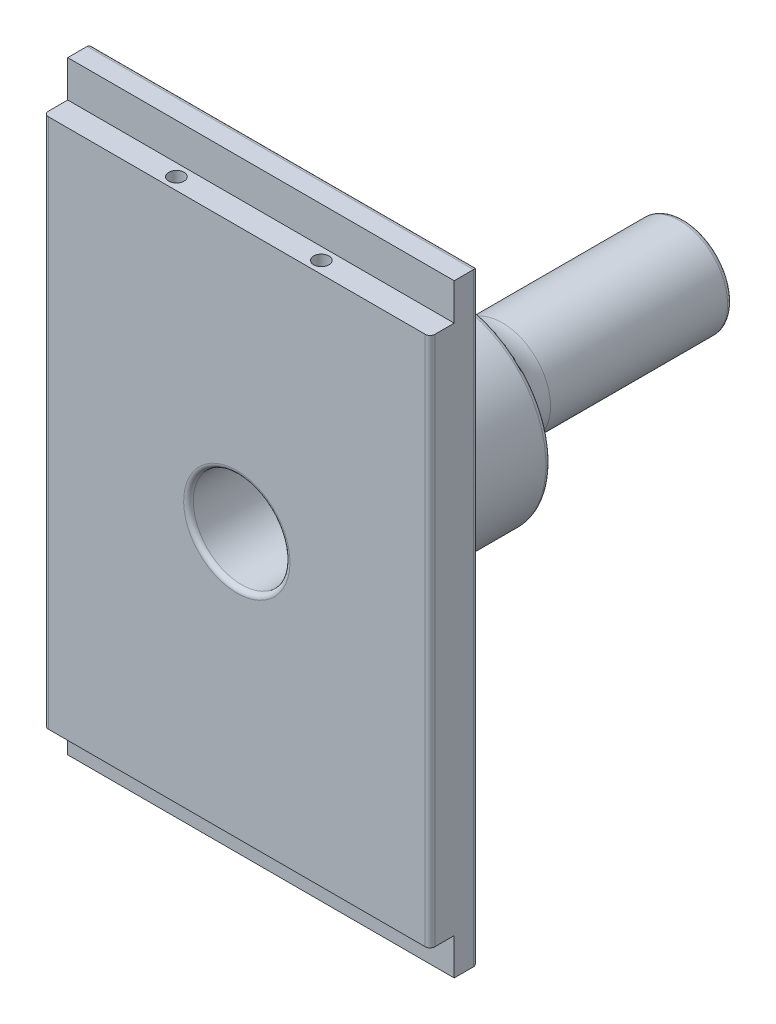
ISO-10303-21;
HEADER;
FILE_DESCRIPTION(('STEP AP214'),'2;1');
FILE_NAME('part.step','',(''),(''),'','','');
FILE_SCHEMA(('AUTOMOTIVE_DESIGN { 1 0 10303 214 1 1 1 1 }'));
ENDSEC;
DATA;
#1=APPLICATION_CONTEXT('core data for automotive mechanical design processes');
#2=APPLICATION_PROTOCOL_DEFINITION('international standard','automotive_design',2000,#1);
#3=PRODUCT_CONTEXT('',#1,'mechanical');
#4=PRODUCT('Part','Part','',(#3));
#5=PRODUCT_RELATED_PRODUCT_CATEGORY('part','',(#4));
#6=PRODUCT_DEFINITION_FORMATION('','',#4);
#7=PRODUCT_DEFINITION_CONTEXT('part definition',#1,'design');
#8=PRODUCT_DEFINITION('design','',#6,#7);
#9=PRODUCT_DEFINITION_SHAPE('','',#8);
#10=(LENGTH_UNIT() NAMED_UNIT(*) SI_UNIT(.MILLI.,.METRE.));
#11=(NAMED_UNIT(*) PLANE_ANGLE_UNIT() SI_UNIT($,.RADIAN.));
#12=(NAMED_UNIT(*) SI_UNIT($,.STERADIAN.) SOLID_ANGLE_UNIT());
#13=UNCERTAINTY_MEASURE_WITH_UNIT(LENGTH_MEASURE(1.E-05),#10,'distance_accuracy_value','');
#14=(GEOMETRIC_REPRESENTATION_CONTEXT(3) GLOBAL_UNCERTAINTY_ASSIGNED_CONTEXT((#13)) GLOBAL_UNIT_ASSIGNED_CONTEXT((#10,
#11,#12)) REPRESENTATION_CONTEXT('',''));
#15=CARTESIAN_POINT('',(0.,0.,0.));
#16=DIRECTION('',(0.,0.,1.));
#17=DIRECTION('',(1.,0.,0.));
#18=AXIS2_PLACEMENT_3D('',#15,#16,#17);
#19=CARTESIAN_POINT('',(50.8,1.77367252013231E-13,50.8));
#20=DIRECTION('',(0.,0.,-1.));
#21=DIRECTION('',(0.,-1.,0.));
#22=AXIS2_PLACEMENT_3D('',#19,#20,#21);
#23=PLANE('',#22);
#24=CARTESIAN_POINT('',(0.,2.08721928629529E-13,50.8));
#25=DIRECTION('',(0.,0.,-1.));
#26=DIRECTION('',(0.,-1.,0.));
#27=AXIS2_PLACEMENT_3D('',#24,#25,#26);
#28=CIRCLE('',#27,26.67);
#29=CARTESIAN_POINT('',(0.,-26.6699999999998,50.8000000000001));
#30=VERTEX_POINT('',#29);
#31=EDGE_CURVE('E256',#30,#30,#28,.F.);
#32=ORIENTED_EDGE('',*,*,#31,.T.);
#33=EDGE_LOOP('',(#32));
#34=FACE_BOUND('',#33,.T.);
#35=DIRECTION('',(-1.,0.,0.));
#36=VECTOR('',#35,1.);
#37=CARTESIAN_POINT('',(50.7999999999997,78.1050000000002,50.7999999999997));
#38=LINE('',#37,#36);
#39=CARTESIAN_POINT('',(-49.5300000000003,78.1049999999998,50.7999999999997));
#40=VERTEX_POINT('',#39);
#41=CARTESIAN_POINT('',(49.5299999999997,78.1050000000002,50.7999999999997));
#42=VERTEX_POINT('',#41);
#43=EDGE_CURVE('E251',#40,#42,#38,.F.);
#44=ORIENTED_EDGE('',*,*,#43,.T.);
#45=DIRECTION('',(0.,-1.,0.));
#46=VECTOR('',#45,1.);
#47=CARTESIAN_POINT('',(49.53,1.729330707129E-13,50.8));
#48=LINE('',#47,#46);
#49=CARTESIAN_POINT('',(49.5300000000003,-78.1049999999999,50.8000000000003));
#50=VERTEX_POINT('',#49);
#51=EDGE_CURVE('E253',#42,#50,#48,.T.);
#52=ORIENTED_EDGE('',*,*,#51,.T.);
#53=DIRECTION('',(-1.,0.,0.));
#54=VECTOR('',#53,1.);
#55=CARTESIAN_POINT('',(50.8000000000003,-78.1049999999999,50.8000000000003));
#56=LINE('',#55,#54);
#57=CARTESIAN_POINT('',(-49.5299999999997,-78.1050000000002,50.8000000000003));
#58=VERTEX_POINT('',#57);
#59=EDGE_CURVE('E249',#50,#58,#56,.T.);
#60=ORIENTED_EDGE('',*,*,#59,.T.);
#61=DIRECTION('',(0.,-1.,0.));
#62=VECTOR('',#61,1.);
#63=CARTESIAN_POINT('',(-49.5300000000003,79.3749999999998,50.7999999999997));
#64=LINE('',#63,#62);
#65=EDGE_CURVE('E247',#58,#40,#64,.F.);
#66=ORIENTED_EDGE('',*,*,#65,.T.);
#67=EDGE_LOOP('',(#44,#52,#60,#66));
#68=FACE_BOUND('',#67,.T.);
#69=ADVANCED_FACE('F36',(#34,#68),#23,.T.);
#70=CARTESIAN_POINT('',(50.7999999999997,79.3750000000002,50.8));
#71=DIRECTION('',(0.,1.,0.));
#72=DIRECTION('',(0.,0.,-1.));
#73=AXIS2_PLACEMENT_3D('',#70,#71,#72);
#74=PLANE('',#73);
#75=DIRECTION('',(0.,0.,-1.));
#76=VECTOR('',#75,1.);
#77=CARTESIAN_POINT('',(50.7999999999997,79.3750000000002,50.8));
#78=LINE('',#77,#76);
#79=CARTESIAN_POINT('',(50.7999999999997,79.3750000000002,57.1500000000002));
#80=VERTEX_POINT('',#79);
#81=CARTESIAN_POINT('',(50.7999999999997,79.3750000000002,52.0699999999997));
#82=VERTEX_POINT('',#81);
#83=EDGE_CURVE('E217',#80,#82,#78,.T.);
#84=ORIENTED_EDGE('',*,*,#83,.T.);
#85=DIRECTION('',(-1.,0.,0.));
#86=VECTOR('',#85,1.);
#87=CARTESIAN_POINT('',(50.7999999999997,79.3750000000002,52.0699999999997));
#88=LINE('',#87,#86);
#89=CARTESIAN_POINT('',(-50.8000000000003,79.3749999999998,52.0699999999997));
#90=VERTEX_POINT('',#89);
#91=EDGE_CURVE('E59',#82,#90,#88,.T.);
#92=ORIENTED_EDGE('',*,*,#91,.T.);
#93=DIRECTION('',(0.,0.,-1.));
#94=VECTOR('',#93,1.);
#95=CARTESIAN_POINT('',(-50.8000000000003,79.3749999999998,50.8));
#96=LINE('',#95,#94);
#97=CARTESIAN_POINT('',(-50.8000000000003,79.3749999999998,57.1500000000002));
#98=VERTEX_POINT('',#97);
#99=EDGE_CURVE('E202',#98,#90,#96,.T.);
#100=ORIENTED_EDGE('',*,*,#99,.F.);
#101=DIRECTION('',(-1.,0.,0.));
#102=VECTOR('',#101,1.);
#103=CARTESIAN_POINT('',(50.7999999999997,79.3750000000002,57.1500000000002));
#104=LINE('',#103,#102);
#105=EDGE_CURVE('E220',#80,#98,#104,.T.);
#106=ORIENTED_EDGE('',*,*,#105,.F.);
#107=EDGE_LOOP('',(#84,#92,#100,#106));
#108=FACE_BOUND('',#107,.T.);
#109=ADVANCED_FACE('F311',(#108),#74,.T.);
#110=CARTESIAN_POINT('',(50.7999999999997,79.3750000000002,57.1500000000002));
#111=DIRECTION('',(0.,0.,1.));
#112=DIRECTION('',(0.,1.,0.));
#113=AXIS2_PLACEMENT_3D('',#110,#111,#112);
#114=PLANE('',#113);
#115=ORIENTED_EDGE('',*,*,#105,.T.);
#116=DIRECTION('',(0.,1.,0.));
#117=VECTOR('',#116,1.);
#118=CARTESIAN_POINT('',(-50.8000000000003,79.3749999999998,57.1500000000002));
#119=LINE('',#118,#117);
#120=CARTESIAN_POINT('',(-50.8000000000002,69.7229999999998,57.1500000000002));
#121=VERTEX_POINT('',#120);
#122=EDGE_CURVE('E199',#121,#98,#119,.T.);
#123=ORIENTED_EDGE('',*,*,#122,.F.);
#124=DIRECTION('',(-1.,0.,0.));
#125=VECTOR('',#124,1.);
#126=CARTESIAN_POINT('',(50.7999999999998,69.7230000000002,57.1500000000002));
#127=LINE('',#126,#125);
#128=CARTESIAN_POINT('',(50.7999999999998,69.7230000000002,57.1500000000002));
#129=VERTEX_POINT('',#128);
#130=EDGE_CURVE('E223',#129,#121,#127,.T.);
#131=ORIENTED_EDGE('',*,*,#130,.F.);
#132=DIRECTION('',(0.,1.,0.));
#133=VECTOR('',#132,1.);
#134=CARTESIAN_POINT('',(50.7999999999997,79.3750000000002,57.1500000000002));
#135=LINE('',#134,#133);
#136=EDGE_CURVE('E214',#129,#80,#135,.T.);
#137=ORIENTED_EDGE('',*,*,#136,.T.);
#138=EDGE_LOOP('',(#115,#123,#131,#137));
#139=FACE_BOUND('',#138,.T.);
#140=ADVANCED_FACE('F317',(#139),#114,.T.);
#141=CARTESIAN_POINT('',(50.7999999999998,69.7230000000002,57.1500000000002));
#142=DIRECTION('',(0.,1.,0.));
#143=DIRECTION('',(0.,0.,-1.));
#144=AXIS2_PLACEMENT_3D('',#141,#142,#143);
#145=PLANE('',#144);
#146=CARTESIAN_POINT('',(-19.0500000000002,69.7229999999996,60.3250000000002));
#147=DIRECTION('',(0.,1.,0.));
#148=DIRECTION('',(0.,0.,-1.));
#149=AXIS2_PLACEMENT_3D('',#146,#147,#148);
#150=CIRCLE('',#149,2.01929999999999);
#151=CARTESIAN_POINT('',(-19.0500000000002,69.7229999999997,58.3057000000002));
#152=VERTEX_POINT('',#151);
#153=EDGE_CURVE('E177',#152,#152,#150,.T.);
#154=ORIENTED_EDGE('',*,*,#153,.F.);
#155=EDGE_LOOP('',(#154));
#156=FACE_BOUND('',#155,.T.);
#157=CARTESIAN_POINT('',(19.0499999999998,69.7229999999997,60.3250000000002));
#158=DIRECTION('',(0.,1.,0.));
#159=DIRECTION('',(0.,0.,-1.));
#160=AXIS2_PLACEMENT_3D('',#157,#158,#159);
#161=CIRCLE('',#160,2.01929999999999);
#162=CARTESIAN_POINT('',(19.0499999999998,69.7229999999998,58.3057000000002));
#163=VERTEX_POINT('',#162);
#164=EDGE_CURVE('E183',#163,#163,#161,.T.);
#165=ORIENTED_EDGE('',*,*,#164,.F.);
#166=EDGE_LOOP('',(#165));
#167=FACE_BOUND('',#166,.T.);
#168=DIRECTION('',(-1.,0.,0.));
#169=VECTOR('',#168,1.);
#170=CARTESIAN_POINT('',(50.7999999999998,69.7229999999998,63.5000000000002));
#171=LINE('',#170,#169);
#172=CARTESIAN_POINT('',(49.5299999999998,69.7229999999998,63.5000000000002));
#173=VERTEX_POINT('',#172);
#174=CARTESIAN_POINT('',(-49.5300000000002,69.7229999999995,63.5000000000002));
#175=VERTEX_POINT('',#174);
#176=EDGE_CURVE('E226',#173,#175,#171,.T.);
#177=ORIENTED_EDGE('',*,*,#176,.F.);
#178=CARTESIAN_POINT('',(49.5299999999998,69.7229999999999,62.2300000000002));
#179=DIRECTION('',(0.,1.,0.));
#180=DIRECTION('',(0.,0.,-1.));
#181=AXIS2_PLACEMENT_3D('',#178,#179,#180);
#182=CIRCLE('',#181,1.27);
#183=CARTESIAN_POINT('',(50.7999999999998,69.7229999999999,62.2300000000002));
#184=VERTEX_POINT('',#183);
#185=EDGE_CURVE('E272',#173,#184,#182,.T.);
#186=ORIENTED_EDGE('',*,*,#185,.T.);
#187=DIRECTION('',(0.,0.,-1.));
#188=VECTOR('',#187,1.);
#189=CARTESIAN_POINT('',(50.7999999999998,69.7230000000002,57.1500000000002));
#190=LINE('',#189,#188);
#191=EDGE_CURVE('E212',#184,#129,#190,.T.);
#192=ORIENTED_EDGE('',*,*,#191,.T.);
#193=ORIENTED_EDGE('',*,*,#130,.T.);
#194=DIRECTION('',(0.,0.,-1.));
#195=VECTOR('',#194,1.);
#196=CARTESIAN_POINT('',(-50.8000000000002,69.7229999999998,57.1500000000002));
#197=LINE('',#196,#195);
#198=CARTESIAN_POINT('',(-50.8000000000002,69.7229999999995,62.2300000000002));
#199=VERTEX_POINT('',#198);
#200=EDGE_CURVE('E197',#199,#121,#197,.T.);
#201=ORIENTED_EDGE('',*,*,#200,.F.);
#202=CARTESIAN_POINT('',(-49.5300000000002,69.7229999999996,62.2300000000002));
#203=DIRECTION('',(0.,1.,0.));
#204=DIRECTION('',(0.,0.,-1.));
#205=AXIS2_PLACEMENT_3D('',#202,#203,#204);
#206=CIRCLE('',#205,1.27);
#207=EDGE_CURVE('E270',#199,#175,#206,.T.);
#208=ORIENTED_EDGE('',*,*,#207,.T.);
#209=EDGE_LOOP('',(#177,#186,#192,#193,#201,#208));
#210=FACE_BOUND('',#209,.T.);
#211=ADVANCED_FACE('F393',(#156,#167,#210),#145,.T.);
#212=CARTESIAN_POINT('',(50.7999999999998,69.7229999999998,63.5000000000002));
#213=DIRECTION('',(0.,0.,1.));
#214=DIRECTION('',(0.,1.,0.));
#215=AXIS2_PLACEMENT_3D('',#212,#213,#214);
#216=PLANE('',#215);
#217=CARTESIAN_POINT('',(0.,0.,63.5000000000002));
#218=DIRECTION('',(0.,0.,1.));
#219=DIRECTION('',(0.,1.,0.));
#220=AXIS2_PLACEMENT_3D('',#217,#218,#219);
#221=CIRCLE('',#220,13.97);
#222=CARTESIAN_POINT('',(0.,13.97,63.5000000000002));
#223=VERTEX_POINT('',#222);
#224=EDGE_CURVE('E267',#223,#223,#221,.F.);
#225=ORIENTED_EDGE('',*,*,#224,.T.);
#226=EDGE_LOOP('',(#225));
#227=FACE_BOUND('',#226,.T.);
#228=DIRECTION('',(-1.,0.,0.));
#229=VECTOR('',#228,1.);
#230=CARTESIAN_POINT('',(50.8000000000002,-69.7230000000001,63.5000000000002));
#231=LINE('',#230,#229);
#232=CARTESIAN_POINT('',(49.5300000000002,-69.7230000000001,63.5000000000002));
#233=VERTEX_POINT('',#232);
#234=CARTESIAN_POINT('',(-49.5299999999998,-69.7230000000004,63.5000000000002));
#235=VERTEX_POINT('',#234);
#236=EDGE_CURVE('E229',#233,#235,#231,.T.);
#237=ORIENTED_EDGE('',*,*,#236,.F.);
#238=DIRECTION('',(0.,1.,0.));
#239=VECTOR('',#238,1.);
#240=CARTESIAN_POINT('',(49.5299999999998,69.7229999999998,63.5000000000002));
#241=LINE('',#240,#239);
#242=EDGE_CURVE('E264',#233,#173,#241,.T.);
#243=ORIENTED_EDGE('',*,*,#242,.T.);
#244=ORIENTED_EDGE('',*,*,#176,.T.);
#245=DIRECTION('',(0.,1.,0.));
#246=VECTOR('',#245,1.);
#247=CARTESIAN_POINT('',(-49.5299999999998,-69.7230000000004,63.5000000000002));
#248=LINE('',#247,#246);
#249=EDGE_CURVE('E262',#175,#235,#248,.F.);
#250=ORIENTED_EDGE('',*,*,#249,.T.);
#251=EDGE_LOOP('',(#237,#243,#244,#250));
#252=FACE_BOUND('',#251,.T.);
#253=ADVANCED_FACE('F402',(#227,#252),#216,.T.);
#254=CARTESIAN_POINT('',(50.8000000000002,-69.7230000000001,57.1500000000003));
#255=DIRECTION('',(0.,-1.,0.));
#256=DIRECTION('',(0.,0.,1.));
#257=AXIS2_PLACEMENT_3D('',#254,#255,#256);
#258=PLANE('',#257);
#259=CARTESIAN_POINT('',(-19.0499999999998,-69.7230000000003,60.3250000000002));
#260=DIRECTION('',(0.,-1.,0.));
#261=DIRECTION('',(0.,0.,1.));
#262=AXIS2_PLACEMENT_3D('',#259,#260,#261);
#263=CIRCLE('',#262,2.01929999999999);
#264=CARTESIAN_POINT('',(-19.0499999999998,-69.7230000000003,62.3443000000002));
#265=VERTEX_POINT('',#264);
#266=EDGE_CURVE('E165',#265,#265,#263,.T.);
#267=ORIENTED_EDGE('',*,*,#266,.F.);
#268=EDGE_LOOP('',(#267));
#269=FACE_BOUND('',#268,.T.);
#270=CARTESIAN_POINT('',(19.0500000000002,-69.7230000000002,60.3250000000002));
#271=DIRECTION('',(0.,-1.,0.));
#272=DIRECTION('',(0.,0.,1.));
#273=AXIS2_PLACEMENT_3D('',#270,#271,#272);
#274=CIRCLE('',#273,2.01929999999999);
#275=CARTESIAN_POINT('',(19.0500000000002,-69.7230000000002,62.3443000000002));
#276=VERTEX_POINT('',#275);
#277=EDGE_CURVE('E171',#276,#276,#274,.T.);
#278=ORIENTED_EDGE('',*,*,#277,.F.);
#279=EDGE_LOOP('',(#278));
#280=FACE_BOUND('',#279,.T.);
#281=DIRECTION('',(0.,0.,1.));
#282=VECTOR('',#281,1.);
#283=CARTESIAN_POINT('',(50.8000000000002,-69.7230000000001,57.1500000000003));
#284=LINE('',#283,#282);
#285=CARTESIAN_POINT('',(50.8000000000002,-69.7230000000001,57.1500000000003));
#286=VERTEX_POINT('',#285);
#287=CARTESIAN_POINT('',(50.8000000000002,-69.7230000000001,62.2300000000002));
#288=VERTEX_POINT('',#287);
#289=EDGE_CURVE('E209',#286,#288,#284,.T.);
#290=ORIENTED_EDGE('',*,*,#289,.T.);
#291=CARTESIAN_POINT('',(49.5300000000002,-69.7230000000001,62.2300000000002));
#292=DIRECTION('',(0.,-1.,0.));
#293=DIRECTION('',(0.,0.,1.));
#294=AXIS2_PLACEMENT_3D('',#291,#292,#293);
#295=CIRCLE('',#294,1.27);
#296=EDGE_CURVE('E281',#288,#233,#295,.T.);
#297=ORIENTED_EDGE('',*,*,#296,.T.);
#298=ORIENTED_EDGE('',*,*,#236,.T.);
#299=CARTESIAN_POINT('',(-49.5299999999998,-69.7230000000004,62.2300000000002));
#300=DIRECTION('',(0.,-1.,0.));
#301=DIRECTION('',(0.,0.,1.));
#302=AXIS2_PLACEMENT_3D('',#299,#300,#301);
#303=CIRCLE('',#302,1.27);
#304=CARTESIAN_POINT('',(-50.7999999999998,-69.7230000000004,62.2300000000002));
#305=VERTEX_POINT('',#304);
#306=EDGE_CURVE('E279',#235,#305,#303,.T.);
#307=ORIENTED_EDGE('',*,*,#306,.T.);
#308=DIRECTION('',(0.,0.,1.));
#309=VECTOR('',#308,1.);
#310=CARTESIAN_POINT('',(-50.7999999999998,-69.7230000000004,57.1500000000003));
#311=LINE('',#310,#309);
#312=CARTESIAN_POINT('',(-50.7999999999998,-69.7230000000004,57.1500000000003));
#313=VERTEX_POINT('',#312);
#314=EDGE_CURVE('E194',#313,#305,#311,.T.);
#315=ORIENTED_EDGE('',*,*,#314,.F.);
#316=DIRECTION('',(-1.,0.,0.));
#317=VECTOR('',#316,1.);
#318=CARTESIAN_POINT('',(50.8000000000002,-69.7230000000001,57.1500000000003));
#319=LINE('',#318,#317);
#320=EDGE_CURVE('E232',#286,#313,#319,.T.);
#321=ORIENTED_EDGE('',*,*,#320,.F.);
#322=EDGE_LOOP('',(#290,#297,#298,#307,#315,#321));
#323=FACE_BOUND('',#322,.T.);
#324=ADVANCED_FACE('F386',(#269,#280,#323),#258,.T.);
#325=CARTESIAN_POINT('',(50.8000000000003,-79.3750000000001,57.1500000000003));
#326=DIRECTION('',(0.,0.,1.));
#327=DIRECTION('',(0.,1.,0.));
#328=AXIS2_PLACEMENT_3D('',#325,#326,#327);
#329=PLANE('',#328);
#330=ORIENTED_EDGE('',*,*,#320,.T.);
#331=DIRECTION('',(0.,1.,0.));
#332=VECTOR('',#331,1.);
#333=CARTESIAN_POINT('',(-50.7999999999997,-79.3750000000005,57.1500000000003));
#334=LINE('',#333,#332);
#335=CARTESIAN_POINT('',(-50.7999999999997,-79.3750000000005,57.1500000000003));
#336=VERTEX_POINT('',#335);
#337=EDGE_CURVE('E191',#336,#313,#334,.T.);
#338=ORIENTED_EDGE('',*,*,#337,.F.);
#339=DIRECTION('',(-1.,0.,0.));
#340=VECTOR('',#339,1.);
#341=CARTESIAN_POINT('',(50.8000000000003,-79.3750000000001,57.1500000000003));
#342=LINE('',#341,#340);
#343=CARTESIAN_POINT('',(50.8000000000003,-79.3750000000001,57.1500000000003));
#344=VERTEX_POINT('',#343);
#345=EDGE_CURVE('E219',#344,#336,#342,.T.);
#346=ORIENTED_EDGE('',*,*,#345,.F.);
#347=DIRECTION('',(0.,1.,0.));
#348=VECTOR('',#347,1.);
#349=CARTESIAN_POINT('',(50.8000000000003,-79.3750000000001,57.1500000000003));
#350=LINE('',#349,#348);
#351=EDGE_CURVE('E206',#344,#286,#350,.T.);
#352=ORIENTED_EDGE('',*,*,#351,.T.);
#353=EDGE_LOOP('',(#330,#338,#346,#352));
#354=FACE_BOUND('',#353,.T.);
#355=ADVANCED_FACE('F380',(#354),#329,.T.);
#356=CARTESIAN_POINT('',(50.8000000000003,-79.3749999999998,50.8000000000003));
#357=DIRECTION('',(0.,-1.,0.));
#358=DIRECTION('',(0.,0.,1.));
#359=AXIS2_PLACEMENT_3D('',#356,#357,#358);
#360=PLANE('',#359);
#361=DIRECTION('',(0.,0.,1.));
#362=VECTOR('',#361,1.);
#363=CARTESIAN_POINT('',(-50.7999999999997,-79.3750000000002,50.8000000000003));
#364=LINE('',#363,#362);
#365=CARTESIAN_POINT('',(-50.7999999999997,-79.3750000000002,52.0700000000003));
#366=VERTEX_POINT('',#365);
#367=EDGE_CURVE('E189',#366,#336,#364,.T.);
#368=ORIENTED_EDGE('',*,*,#367,.F.);
#369=DIRECTION('',(-1.,0.,0.));
#370=VECTOR('',#369,1.);
#371=CARTESIAN_POINT('',(50.8000000000003,-79.3749999999999,52.0700000000003));
#372=LINE('',#371,#370);
#373=CARTESIAN_POINT('',(50.8000000000003,-79.3749999999999,52.0700000000003));
#374=VERTEX_POINT('',#373);
#375=EDGE_CURVE('E284',#366,#374,#372,.F.);
#376=ORIENTED_EDGE('',*,*,#375,.T.);
#377=DIRECTION('',(0.,0.,1.));
#378=VECTOR('',#377,1.);
#379=CARTESIAN_POINT('',(50.8000000000003,-79.3749999999998,50.8000000000003));
#380=LINE('',#379,#378);
#381=EDGE_CURVE('E204',#374,#344,#380,.T.);
#382=ORIENTED_EDGE('',*,*,#381,.T.);
#383=ORIENTED_EDGE('',*,*,#345,.T.);
#384=EDGE_LOOP('',(#368,#376,#382,#383));
#385=FACE_BOUND('',#384,.T.);
#386=ADVANCED_FACE('F322',(#385),#360,.T.);
#387=CARTESIAN_POINT('',(50.7999999999997,79.3750000000002,50.8));
#388=DIRECTION('',(1.,0.,0.));
#389=DIRECTION('',(0.,0.,-1.));
#390=AXIS2_PLACEMENT_3D('',#387,#388,#389);
#391=PLANE('',#390);
#392=ORIENTED_EDGE('',*,*,#191,.F.);
#393=DIRECTION('',(0.,1.,0.));
#394=VECTOR('',#393,1.);
#395=CARTESIAN_POINT('',(50.7999999999997,79.3750000000002,62.2300000000002));
#396=LINE('',#395,#394);
#397=EDGE_CURVE('E277',#184,#288,#396,.F.);
#398=ORIENTED_EDGE('',*,*,#397,.T.);
#399=ORIENTED_EDGE('',*,*,#289,.F.);
#400=ORIENTED_EDGE('',*,*,#351,.F.);
#401=ORIENTED_EDGE('',*,*,#381,.F.);
#402=DIRECTION('',(0.,-1.,0.));
#403=VECTOR('',#402,1.);
#404=CARTESIAN_POINT('',(50.7999999999997,79.3750000000002,52.0699999999997));
#405=LINE('',#404,#403);
#406=EDGE_CURVE('E274',#374,#82,#405,.F.);
#407=ORIENTED_EDGE('',*,*,#406,.T.);
#408=ORIENTED_EDGE('',*,*,#83,.F.);
#409=ORIENTED_EDGE('',*,*,#136,.F.);
#410=EDGE_LOOP('',(#392,#398,#399,#400,#401,#407,#408,#409));
#411=FACE_BOUND('',#410,.T.);
#412=ADVANCED_FACE('F373',(#411),#391,.T.);
#413=CARTESIAN_POINT('',(-50.8000000000003,79.3749999999998,50.8));
#414=DIRECTION('',(1.,0.,0.));
#415=DIRECTION('',(0.,0.,-1.));
#416=AXIS2_PLACEMENT_3D('',#413,#414,#415);
#417=PLANE('',#416);
#418=ORIENTED_EDGE('',*,*,#99,.T.);
#419=DIRECTION('',(0.,-1.,0.));
#420=VECTOR('',#419,1.);
#421=CARTESIAN_POINT('',(-50.7999999999997,-79.3750000000002,52.0700000000003));
#422=LINE('',#421,#420);
#423=EDGE_CURVE('E51',#90,#366,#422,.T.);
#424=ORIENTED_EDGE('',*,*,#423,.T.);
#425=ORIENTED_EDGE('',*,*,#367,.T.);
#426=ORIENTED_EDGE('',*,*,#337,.T.);
#427=ORIENTED_EDGE('',*,*,#314,.T.);
#428=DIRECTION('',(0.,1.,0.));
#429=VECTOR('',#428,1.);
#430=CARTESIAN_POINT('',(-50.8000000000002,69.7229999999995,62.2300000000002));
#431=LINE('',#430,#429);
#432=EDGE_CURVE('E286',#305,#199,#431,.T.);
#433=ORIENTED_EDGE('',*,*,#432,.T.);
#434=ORIENTED_EDGE('',*,*,#200,.T.);
#435=ORIENTED_EDGE('',*,*,#122,.T.);
#436=EDGE_LOOP('',(#418,#424,#425,#426,#427,#433,#434,#435));
#437=FACE_BOUND('',#436,.T.);
#438=ADVANCED_FACE('F383',(#437),#417,.F.);
#439=CARTESIAN_POINT('',(19.0499999999998,44.3229999999997,60.3249999999988));
#440=DIRECTION('',(0.,1.,0.));
#441=DIRECTION('',(0.,0.,-1.));
#442=AXIS2_PLACEMENT_3D('',#439,#440,#441);
#443=CONICAL_SURFACE('',#442,2.01929999999998,1.02974425867665);
#444=CARTESIAN_POINT('',(19.0499999999999,43.1096821519974,60.3249999999988));
#445=VERTEX_POINT('',#444);
#446=VERTEX_LOOP('',#445);
#447=FACE_BOUND('',#446,.T.);
#448=CARTESIAN_POINT('',(19.0499999999998,44.3229999999997,60.3249999999988));
#449=DIRECTION('',(0.,1.,0.));
#450=DIRECTION('',(0.,0.,-1.));
#451=AXIS2_PLACEMENT_3D('',#448,#449,#450);
#452=CIRCLE('',#451,2.01929999999998);
#453=CARTESIAN_POINT('',(19.0499999999998,44.3229999999998,58.3056999999989));
#454=VERTEX_POINT('',#453);
#455=EDGE_CURVE('E186',#454,#454,#452,.T.);
#456=ORIENTED_EDGE('',*,*,#455,.T.);
#457=EDGE_LOOP('',(#456));
#458=FACE_BOUND('',#457,.T.);
#459=ADVANCED_FACE('F426',(#447,#458),#443,.F.);
#460=CARTESIAN_POINT('',(19.0499999999998,69.7229999999997,60.3250000000002));
#461=DIRECTION('',(0.,1.,0.));
#462=DIRECTION('',(0.,0.,-1.));
#463=AXIS2_PLACEMENT_3D('',#460,#461,#462);
#464=CYLINDRICAL_SURFACE('',#463,2.01929999999999);
#465=ORIENTED_EDGE('',*,*,#455,.F.);
#466=EDGE_LOOP('',(#465));
#467=FACE_BOUND('',#466,.T.);
#468=ORIENTED_EDGE('',*,*,#164,.T.);
#469=EDGE_LOOP('',(#468));
#470=FACE_BOUND('',#469,.T.);
#471=ADVANCED_FACE('F476',(#467,#470),#464,.F.);
#472=CARTESIAN_POINT('',(-19.0500000000002,44.3229999999996,60.3249999999988));
#473=DIRECTION('',(0.,1.,0.));
#474=DIRECTION('',(0.,0.,-1.));
#475=AXIS2_PLACEMENT_3D('',#472,#473,#474);
#476=CONICAL_SURFACE('',#475,2.01929999999998,1.02974425867665);
#477=CARTESIAN_POINT('',(-19.0500000000001,43.1096821519972,60.3249999999988));
#478=VERTEX_POINT('',#477);
#479=VERTEX_LOOP('',#478);
#480=FACE_BOUND('',#479,.T.);
#481=CARTESIAN_POINT('',(-19.0500000000002,44.3229999999996,60.3249999999988));
#482=DIRECTION('',(0.,1.,0.));
#483=DIRECTION('',(0.,0.,-1.));
#484=AXIS2_PLACEMENT_3D('',#481,#482,#483);
#485=CIRCLE('',#484,2.01929999999998);
#486=CARTESIAN_POINT('',(-19.0500000000002,44.3229999999997,58.3056999999989));
#487=VERTEX_POINT('',#486);
#488=EDGE_CURVE('E180',#487,#487,#485,.T.);
#489=ORIENTED_EDGE('',*,*,#488,.T.);
#490=EDGE_LOOP('',(#489));
#491=FACE_BOUND('',#490,.T.);
#492=ADVANCED_FACE('F486',(#480,#491),#476,.F.);
#493=CARTESIAN_POINT('',(-19.0500000000002,69.7229999999996,60.3250000000002));
#494=DIRECTION('',(0.,1.,0.));
#495=DIRECTION('',(0.,0.,-1.));
#496=AXIS2_PLACEMENT_3D('',#493,#494,#495);
#497=CYLINDRICAL_SURFACE('',#496,2.01929999999999);
#498=ORIENTED_EDGE('',*,*,#488,.F.);
#499=EDGE_LOOP('',(#498));
#500=FACE_BOUND('',#499,.T.);
#501=ORIENTED_EDGE('',*,*,#153,.T.);
#502=EDGE_LOOP('',(#501));
#503=FACE_BOUND('',#502,.T.);
#504=ADVANCED_FACE('F498',(#500,#503),#497,.F.);
#505=CARTESIAN_POINT('',(19.0500000000002,-44.3230000000002,60.3250000000002));
#506=DIRECTION('',(0.,-1.,0.));
#507=DIRECTION('',(0.,0.,1.));
#508=AXIS2_PLACEMENT_3D('',#505,#506,#507);
#509=CONICAL_SURFACE('',#508,2.01929999999998,1.02974425867665);
#510=CARTESIAN_POINT('',(19.0500000000002,-43.1096821519978,60.3250000000002));
#511=VERTEX_POINT('',#510);
#512=VERTEX_LOOP('',#511);
#513=FACE_BOUND('',#512,.T.);
#514=CARTESIAN_POINT('',(19.0500000000002,-44.3230000000002,60.3250000000002));
#515=DIRECTION('',(0.,-1.,0.));
#516=DIRECTION('',(0.,0.,1.));
#517=AXIS2_PLACEMENT_3D('',#514,#515,#516);
#518=CIRCLE('',#517,2.01929999999998);
#519=CARTESIAN_POINT('',(19.0500000000002,-44.3230000000002,62.3443000000002));
#520=VERTEX_POINT('',#519);
#521=EDGE_CURVE('E174',#520,#520,#518,.T.);
#522=ORIENTED_EDGE('',*,*,#521,.T.);
#523=EDGE_LOOP('',(#522));
#524=FACE_BOUND('',#523,.T.);
#525=ADVANCED_FACE('F508',(#513,#524),#509,.F.);
#526=CARTESIAN_POINT('',(19.0500000000002,-69.7230000000002,60.3250000000002));
#527=DIRECTION('',(0.,-1.,0.));
#528=DIRECTION('',(0.,0.,1.));
#529=AXIS2_PLACEMENT_3D('',#526,#527,#528);
#530=CYLINDRICAL_SURFACE('',#529,2.01929999999999);
#531=ORIENTED_EDGE('',*,*,#521,.F.);
#532=EDGE_LOOP('',(#531));
#533=FACE_BOUND('',#532,.T.);
#534=ORIENTED_EDGE('',*,*,#277,.T.);
#535=EDGE_LOOP('',(#534));
#536=FACE_BOUND('',#535,.T.);
#537=ADVANCED_FACE('F520',(#533,#536),#530,.F.);
#538=CARTESIAN_POINT('',(-19.0499999999998,-44.3230000000003,60.3250000000002));
#539=DIRECTION('',(0.,-1.,0.));
#540=DIRECTION('',(0.,0.,1.));
#541=AXIS2_PLACEMENT_3D('',#538,#539,#540);
#542=CONICAL_SURFACE('',#541,2.01929999999998,1.02974425867665);
#543=CARTESIAN_POINT('',(-19.0499999999998,-43.109682151998,60.3250000000002));
#544=VERTEX_POINT('',#543);
#545=VERTEX_LOOP('',#544);
#546=FACE_BOUND('',#545,.T.);
#547=CARTESIAN_POINT('',(-19.0499999999998,-44.3230000000003,60.3250000000002));
#548=DIRECTION('',(0.,-1.,0.));
#549=DIRECTION('',(0.,0.,1.));
#550=AXIS2_PLACEMENT_3D('',#547,#548,#549);
#551=CIRCLE('',#550,2.01929999999998);
#552=CARTESIAN_POINT('',(-19.0499999999998,-44.3230000000003,62.3443000000002));
#553=VERTEX_POINT('',#552);
#554=EDGE_CURVE('E168',#553,#553,#551,.T.);
#555=ORIENTED_EDGE('',*,*,#554,.T.);
#556=EDGE_LOOP('',(#555));
#557=FACE_BOUND('',#556,.T.);
#558=ADVANCED_FACE('F530',(#546,#557),#542,.F.);
#559=CARTESIAN_POINT('',(-19.0499999999998,-69.7230000000003,60.3250000000002));
#560=DIRECTION('',(0.,-1.,0.));
#561=DIRECTION('',(0.,0.,1.));
#562=AXIS2_PLACEMENT_3D('',#559,#560,#561);
#563=CYLINDRICAL_SURFACE('',#562,2.01929999999999);
#564=ORIENTED_EDGE('',*,*,#554,.F.);
#565=EDGE_LOOP('',(#564));
#566=FACE_BOUND('',#565,.T.);
#567=ORIENTED_EDGE('',*,*,#266,.T.);
#568=EDGE_LOOP('',(#567));
#569=FACE_BOUND('',#568,.T.);
#570=ADVANCED_FACE('F542',(#566,#569),#563,.F.);
#571=CARTESIAN_POINT('',(0.,0.,6.35000000000001));
#572=DIRECTION('',(0.,0.,1.));
#573=DIRECTION('',(0.,1.,0.));
#574=AXIS2_PLACEMENT_3D('',#571,#572,#573);
#575=CYLINDRICAL_SURFACE('',#574,25.4);
#576=CARTESIAN_POINT('',(0.,0.,7.62000000000001));
#577=DIRECTION('',(0.,0.,-1.));
#578=DIRECTION('',(0.,-1.,0.));
#579=AXIS2_PLACEMENT_3D('',#576,#577,#578);
#580=CIRCLE('',#579,25.4);
#581=CARTESIAN_POINT('',(0.,-25.4,7.62000000000011));
#582=VERTEX_POINT('',#581);
#583=EDGE_CURVE('E244',#582,#582,#580,.F.);
#584=ORIENTED_EDGE('',*,*,#583,.T.);
#585=EDGE_LOOP('',(#584));
#586=FACE_BOUND('',#585,.T.);
#587=CARTESIAN_POINT('',(0.,2.03503880413791E-13,49.53));
#588=DIRECTION('',(0.,0.,-1.));
#589=DIRECTION('',(0.,-1.,0.));
#590=AXIS2_PLACEMENT_3D('',#587,#588,#589);
#591=CIRCLE('',#590,25.4);
#592=CARTESIAN_POINT('',(0.,-25.3999999999998,49.5300000000001));
#593=VERTEX_POINT('',#592);
#594=EDGE_CURVE('E241',#593,#593,#591,.T.);
#595=ORIENTED_EDGE('',*,*,#594,.T.);
#596=EDGE_LOOP('',(#595));
#597=FACE_BOUND('',#596,.T.);
#598=ADVANCED_FACE('F552',(#586,#597),#575,.T.);
#599=CARTESIAN_POINT('',(0.,-2.22288853990449E-13,-54.102));
#600=DIRECTION('',(0.,0.,1.));
#601=DIRECTION('',(0.,1.,0.));
#602=AXIS2_PLACEMENT_3D('',#599,#600,#601);
#603=CYLINDRICAL_SURFACE('',#602,12.7);
#604=CARTESIAN_POINT('',(0.,0.,-6.29215296063122));
#605=DIRECTION('',(0.,0.,-1.));
#606=DIRECTION('',(0.,-1.,0.));
#607=AXIS2_PLACEMENT_3D('',#604,#605,#606);
#608=CIRCLE('',#607,12.7);
#609=CARTESIAN_POINT('',(0.,-12.7,-6.29215296063116));
#610=VERTEX_POINT('',#609);
#611=EDGE_CURVE('E44',#610,#610,#608,.T.);
#612=ORIENTED_EDGE('',*,*,#611,.T.);
#613=EDGE_LOOP('',(#612));
#614=FACE_BOUND('',#613,.T.);
#615=CARTESIAN_POINT('',(0.,-2.17070805774711E-13,-52.832));
#616=DIRECTION('',(0.,0.,-1.));
#617=DIRECTION('',(0.,-1.,0.));
#618=AXIS2_PLACEMENT_3D('',#615,#616,#617);
#619=CIRCLE('',#618,12.7);
#620=CARTESIAN_POINT('',(0.,-12.7000000000002,-52.8319999999999));
#621=VERTEX_POINT('',#620);
#622=EDGE_CURVE('E238',#621,#621,#619,.F.);
#623=ORIENTED_EDGE('',*,*,#622,.T.);
#624=EDGE_LOOP('',(#623));
#625=FACE_BOUND('',#624,.T.);
#626=ADVANCED_FACE('F298',(#614,#625),#603,.T.);
#627=CARTESIAN_POINT('',(0.,-2.22288853990449E-13,-54.102));
#628=DIRECTION('',(0.,0.,-1.));
#629=DIRECTION('',(0.,-1.,0.));
#630=AXIS2_PLACEMENT_3D('',#627,#628,#629);
#631=PLANE('',#630);
#632=CARTESIAN_POINT('',(0.,-2.22288853990449E-13,-54.102));
#633=DIRECTION('',(0.,0.,-1.));
#634=DIRECTION('',(0.,-1.,0.));
#635=AXIS2_PLACEMENT_3D('',#632,#633,#634);
#636=CIRCLE('',#635,11.43);
#637=CARTESIAN_POINT('',(0.,-11.4300000000002,-54.1019999999999));
#638=VERTEX_POINT('',#637);
#639=EDGE_CURVE('E222',#638,#638,#636,.T.);
#640=ORIENTED_EDGE('',*,*,#639,.T.);
#641=EDGE_LOOP('',(#640));
#642=FACE_BOUND('',#641,.T.);
#643=CARTESIAN_POINT('',(0.,0.,-54.102));
#644=DIRECTION('',(0.,0.,-1.));
#645=DIRECTION('',(0.,-1.,0.));
#646=AXIS2_PLACEMENT_3D('',#643,#644,#645);
#647=CIRCLE('',#646,3.17499999999999);
#648=CARTESIAN_POINT('',(0.,-3.17499999999999,-54.102));
#649=VERTEX_POINT('',#648);
#650=EDGE_CURVE('E153',#649,#649,#647,.T.);
#651=ORIENTED_EDGE('',*,*,#650,.F.);
#652=EDGE_LOOP('',(#651));
#653=FACE_BOUND('',#652,.T.);
#654=ADVANCED_FACE('F572',(#642,#653),#631,.T.);
#655=CARTESIAN_POINT('',(0.,0.,-28.702));
#656=DIRECTION('',(0.,0.,-1.));
#657=DIRECTION('',(0.,-1.,0.));
#658=AXIS2_PLACEMENT_3D('',#655,#656,#657);
#659=CONICAL_SURFACE('',#658,3.17499999999999,1.02974425867665);
#660=CARTESIAN_POINT('',(0.,0.,-26.7942675345875));
#661=VERTEX_POINT('',#660);
#662=VERTEX_LOOP('',#661);
#663=FACE_BOUND('',#662,.T.);
#664=CARTESIAN_POINT('',(0.,0.,-28.702));
#665=DIRECTION('',(0.,0.,-1.));
#666=DIRECTION('',(0.,-1.,0.));
#667=AXIS2_PLACEMENT_3D('',#664,#665,#666);
#668=CIRCLE('',#667,3.17499999999999);
#669=CARTESIAN_POINT('',(0.,-3.17499999999999,-28.702));
#670=VERTEX_POINT('',#669);
#671=EDGE_CURVE('E157',#670,#670,#668,.T.);
#672=ORIENTED_EDGE('',*,*,#671,.T.);
#673=EDGE_LOOP('',(#672));
#674=FACE_BOUND('',#673,.T.);
#675=ADVANCED_FACE('F581',(#663,#674),#659,.F.);
#676=CARTESIAN_POINT('',(0.,0.,-54.102));
#677=DIRECTION('',(0.,0.,-1.));
#678=DIRECTION('',(0.,-1.,0.));
#679=AXIS2_PLACEMENT_3D('',#676,#677,#678);
#680=CYLINDRICAL_SURFACE('',#679,3.17499999999999);
#681=ORIENTED_EDGE('',*,*,#671,.F.);
#682=EDGE_LOOP('',(#681));
#683=FACE_BOUND('',#682,.T.);
#684=ORIENTED_EDGE('',*,*,#650,.T.);
#685=EDGE_LOOP('',(#684));
#686=FACE_BOUND('',#685,.T.);
#687=ADVANCED_FACE('F147',(#683,#686),#680,.F.);
#688=CARTESIAN_POINT('',(0.,0.,12.7000000000002));
#689=DIRECTION('',(0.,0.,1.));
#690=DIRECTION('',(0.,1.,0.));
#691=AXIS2_PLACEMENT_3D('',#688,#689,#690);
#692=CONICAL_SURFACE('',#691,12.7,1.02974425867665);
#693=CARTESIAN_POINT('',(0.,0.,5.06907013835017));
#694=VERTEX_POINT('',#693);
#695=VERTEX_LOOP('',#694);
#696=FACE_BOUND('',#695,.T.);
#697=CARTESIAN_POINT('',(0.,0.,12.7000000000002));
#698=DIRECTION('',(0.,0.,1.));
#699=DIRECTION('',(0.,1.,0.));
#700=AXIS2_PLACEMENT_3D('',#697,#698,#699);
#701=CIRCLE('',#700,12.7);
#702=CARTESIAN_POINT('',(0.,12.7,12.7000000000002));
#703=VERTEX_POINT('',#702);
#704=EDGE_CURVE('E151',#703,#703,#701,.T.);
#705=ORIENTED_EDGE('',*,*,#704,.T.);
#706=EDGE_LOOP('',(#705));
#707=FACE_BOUND('',#706,.T.);
#708=ADVANCED_FACE('F143',(#696,#707),#692,.F.);
#709=CARTESIAN_POINT('',(0.,0.,63.5000000000002));
#710=DIRECTION('',(0.,0.,1.));
#711=DIRECTION('',(0.,1.,0.));
#712=AXIS2_PLACEMENT_3D('',#709,#710,#711);
#713=CYLINDRICAL_SURFACE('',#712,12.7);
#714=CARTESIAN_POINT('',(0.,0.,62.2300000000002));
#715=DIRECTION('',(0.,0.,1.));
#716=DIRECTION('',(0.,1.,0.));
#717=AXIS2_PLACEMENT_3D('',#714,#715,#716);
#718=CIRCLE('',#717,12.7);
#719=CARTESIAN_POINT('',(0.,12.7,62.2300000000002));
#720=VERTEX_POINT('',#719);
#721=EDGE_CURVE('E259',#720,#720,#718,.T.);
#722=ORIENTED_EDGE('',*,*,#721,.T.);
#723=EDGE_LOOP('',(#722));
#724=FACE_BOUND('',#723,.T.);
#725=ORIENTED_EDGE('',*,*,#704,.F.);
#726=EDGE_LOOP('',(#725));
#727=FACE_BOUND('',#726,.T.);
#728=ADVANCED_FACE('F146',(#724,#727),#713,.F.);
#729=CARTESIAN_POINT('',(0.,-2.17070805774711E-13,-52.832));
#730=DIRECTION('',(0.,0.,-1.));
#731=DIRECTION('',(0.,-1.,0.));
#732=AXIS2_PLACEMENT_3D('',#729,#730,#731);
#733=TOROIDAL_SURFACE('',#732,11.43,1.27);
#734=ORIENTED_EDGE('',*,*,#622,.F.);
#735=EDGE_LOOP('',(#734));
#736=FACE_BOUND('',#735,.T.);
#737=ORIENTED_EDGE('',*,*,#639,.F.);
#738=EDGE_LOOP('',(#737));
#739=FACE_BOUND('',#738,.T.);
#740=ADVANCED_FACE('F324',(#736,#739),#733,.T.);
#741=CARTESIAN_POINT('',(0.,0.,7.62000000000001));
#742=DIRECTION('',(0.,0.,-1.));
#743=DIRECTION('',(0.,-1.,0.));
#744=AXIS2_PLACEMENT_3D('',#741,#742,#743);
#745=TOROIDAL_SURFACE('',#744,24.13,1.27);
#746=CARTESIAN_POINT('',(0.,0.,6.35525882175475));
#747=DIRECTION('',(0.,0.,1.));
#748=DIRECTION('',(0.,1.,0.));
#749=AXIS2_PLACEMENT_3D('',#746,#747,#748);
#750=CIRCLE('',#749,24.2454545454551);
#751=CARTESIAN_POINT('',(0.,24.2454545454551,6.35525882175464));
#752=VERTEX_POINT('',#751);
#753=EDGE_CURVE('E11',#752,#752,#750,.T.);
#754=ORIENTED_EDGE('',*,*,#753,.T.);
#755=EDGE_LOOP('',(#754));
#756=FACE_BOUND('',#755,.T.);
#757=ORIENTED_EDGE('',*,*,#583,.F.);
#758=EDGE_LOOP('',(#757));
#759=FACE_BOUND('',#758,.T.);
#760=ADVANCED_FACE('F327',(#756,#759),#745,.T.);
#761=CARTESIAN_POINT('',(0.,2.03503880413791E-13,49.53));
#762=DIRECTION('',(0.,0.,-1.));
#763=DIRECTION('',(0.,-1.,0.));
#764=AXIS2_PLACEMENT_3D('',#761,#762,#763);
#765=TOROIDAL_SURFACE('',#764,26.67,1.27);
#766=ORIENTED_EDGE('',*,*,#31,.F.);
#767=EDGE_LOOP('',(#766));
#768=FACE_BOUND('',#767,.T.);
#769=ORIENTED_EDGE('',*,*,#594,.F.);
#770=EDGE_LOOP('',(#769));
#771=FACE_BOUND('',#770,.T.);
#772=ADVANCED_FACE('F331',(#768,#771),#765,.F.);
#773=CARTESIAN_POINT('',(0.,0.,62.2300000000002));
#774=DIRECTION('',(0.,0.,1.));
#775=DIRECTION('',(0.,1.,0.));
#776=AXIS2_PLACEMENT_3D('',#773,#774,#775);
#777=TOROIDAL_SURFACE('',#776,13.97,1.27);
#778=ORIENTED_EDGE('',*,*,#224,.F.);
#779=EDGE_LOOP('',(#778));
#780=FACE_BOUND('',#779,.T.);
#781=ORIENTED_EDGE('',*,*,#721,.F.);
#782=EDGE_LOOP('',(#781));
#783=FACE_BOUND('',#782,.T.);
#784=ADVANCED_FACE('F335',(#780,#783),#777,.T.);
#785=CARTESIAN_POINT('',(49.5299999999998,69.7229999999998,62.2300000000002));
#786=DIRECTION('',(0.,1.,0.));
#787=DIRECTION('',(0.,0.,-1.));
#788=AXIS2_PLACEMENT_3D('',#785,#786,#787);
#789=CYLINDRICAL_SURFACE('',#788,1.27);
#790=ORIENTED_EDGE('',*,*,#296,.F.);
#791=ORIENTED_EDGE('',*,*,#397,.F.);
#792=ORIENTED_EDGE('',*,*,#185,.F.);
#793=ORIENTED_EDGE('',*,*,#242,.F.);
#794=EDGE_LOOP('',(#790,#791,#792,#793));
#795=FACE_BOUND('',#794,.T.);
#796=ADVANCED_FACE('F339',(#795),#789,.T.);
#797=CARTESIAN_POINT('',(-49.5300000000003,79.3749999999998,52.0699999999997));
#798=DIRECTION('',(0.,1.,0.));
#799=DIRECTION('',(0.,0.,-1.));
#800=AXIS2_PLACEMENT_3D('',#797,#798,#799);
#801=CYLINDRICAL_SURFACE('',#800,1.27);
#802=CARTESIAN_POINT('',(-49.5299999999997,-78.1050000000002,52.0700000000003));
#803=DIRECTION('',(-0.70710678118655,0.707106781186545,0.));
#804=DIRECTION('',(0.707106781186545,0.70710678118655,0.));
#805=AXIS2_PLACEMENT_3D('',#802,#803,#804);
#806=ELLIPSE('',#805,1.79605122421383,1.27);
#807=EDGE_CURVE('E160',#366,#58,#806,.F.);
#808=ORIENTED_EDGE('',*,*,#807,.F.);
#809=ORIENTED_EDGE('',*,*,#423,.F.);
#810=CARTESIAN_POINT('',(-49.5300000000003,78.1049999999998,52.0699999999997));
#811=DIRECTION('',(0.707106781186545,0.70710678118655,0.));
#812=DIRECTION('',(-0.70710678118655,0.707106781186545,0.));
#813=AXIS2_PLACEMENT_3D('',#810,#811,#812);
#814=ELLIPSE('',#813,1.79605122421383,1.27);
#815=EDGE_CURVE('E154',#40,#90,#814,.T.);
#816=ORIENTED_EDGE('',*,*,#815,.F.);
#817=ORIENTED_EDGE('',*,*,#65,.F.);
#818=EDGE_LOOP('',(#808,#809,#816,#817));
#819=FACE_BOUND('',#818,.T.);
#820=ADVANCED_FACE('F343',(#819),#801,.T.);
#821=CARTESIAN_POINT('',(50.7999999999997,78.1050000000002,52.0699999999997));
#822=DIRECTION('',(-1.,0.,0.));
#823=DIRECTION('',(0.,0.,1.));
#824=AXIS2_PLACEMENT_3D('',#821,#822,#823);
#825=CYLINDRICAL_SURFACE('',#824,1.27);
#826=ORIENTED_EDGE('',*,*,#815,.T.);
#827=ORIENTED_EDGE('',*,*,#91,.F.);
#828=CARTESIAN_POINT('',(49.5299999999997,78.1050000000002,52.0699999999997));
#829=DIRECTION('',(-0.70710678118655,0.707106781186545,0.));
#830=DIRECTION('',(-0.707106781186545,-0.70710678118655,0.));
#831=AXIS2_PLACEMENT_3D('',#828,#829,#830);
#832=ELLIPSE('',#831,1.79605122421383,1.27);
#833=EDGE_CURVE('E292',#42,#82,#832,.F.);
#834=ORIENTED_EDGE('',*,*,#833,.F.);
#835=ORIENTED_EDGE('',*,*,#43,.F.);
#836=EDGE_LOOP('',(#826,#827,#834,#835));
#837=FACE_BOUND('',#836,.T.);
#838=ADVANCED_FACE('F351',(#837),#825,.T.);
#839=CARTESIAN_POINT('',(50.8000000000003,-78.1049999999999,52.0700000000003));
#840=DIRECTION('',(-1.,0.,0.));
#841=DIRECTION('',(0.,0.,1.));
#842=AXIS2_PLACEMENT_3D('',#839,#840,#841);
#843=CYLINDRICAL_SURFACE('',#842,1.27);
#844=ORIENTED_EDGE('',*,*,#807,.T.);
#845=ORIENTED_EDGE('',*,*,#59,.F.);
#846=CARTESIAN_POINT('',(49.5300000000003,-78.1049999999999,52.0700000000003));
#847=DIRECTION('',(-0.707106781186545,-0.70710678118655,0.));
#848=DIRECTION('',(-0.70710678118655,0.707106781186545,0.));
#849=AXIS2_PLACEMENT_3D('',#846,#847,#848);
#850=ELLIPSE('',#849,1.79605122421383,1.27);
#851=EDGE_CURVE('E290',#374,#50,#850,.F.);
#852=ORIENTED_EDGE('',*,*,#851,.F.);
#853=ORIENTED_EDGE('',*,*,#375,.F.);
#854=EDGE_LOOP('',(#844,#845,#852,#853));
#855=FACE_BOUND('',#854,.T.);
#856=ADVANCED_FACE('F347',(#855),#843,.T.);
#857=CARTESIAN_POINT('',(49.53,1.78151118928639E-13,52.07));
#858=DIRECTION('',(0.,-1.,0.));
#859=DIRECTION('',(0.,0.,1.));
#860=AXIS2_PLACEMENT_3D('',#857,#858,#859);
#861=CYLINDRICAL_SURFACE('',#860,1.27);
#862=ORIENTED_EDGE('',*,*,#833,.T.);
#863=ORIENTED_EDGE('',*,*,#406,.F.);
#864=ORIENTED_EDGE('',*,*,#851,.T.);
#865=ORIENTED_EDGE('',*,*,#51,.F.);
#866=EDGE_LOOP('',(#862,#863,#864,#865));
#867=FACE_BOUND('',#866,.T.);
#868=ADVANCED_FACE('F307',(#867),#861,.T.);
#869=CARTESIAN_POINT('',(-49.5300000000003,79.3749999999998,62.2300000000002));
#870=DIRECTION('',(0.,-1.,0.));
#871=DIRECTION('',(0.,0.,1.));
#872=AXIS2_PLACEMENT_3D('',#869,#870,#871);
#873=CYLINDRICAL_SURFACE('',#872,1.27);
#874=ORIENTED_EDGE('',*,*,#306,.F.);
#875=ORIENTED_EDGE('',*,*,#249,.F.);
#876=ORIENTED_EDGE('',*,*,#207,.F.);
#877=ORIENTED_EDGE('',*,*,#432,.F.);
#878=EDGE_LOOP('',(#874,#875,#876,#877));
#879=FACE_BOUND('',#878,.T.);
#880=ADVANCED_FACE('F302',(#879),#873,.T.);
#881=CARTESIAN_POINT('',(0.,0.,-6.29215296063121));
#882=DIRECTION('',(0.,0.,-1.));
#883=DIRECTION('',(0.,-1.,0.));
#884=AXIS2_PLACEMENT_3D('',#881,#882,#883);
#885=TOROIDAL_SURFACE('',#884,25.4,12.7);
#886=ORIENTED_EDGE('',*,*,#753,.F.);
#887=EDGE_LOOP('',(#886));
#888=FACE_BOUND('',#887,.T.);
#889=ORIENTED_EDGE('',*,*,#611,.F.);
#890=EDGE_LOOP('',(#889));
#891=FACE_BOUND('',#890,.T.);
#892=ADVANCED_FACE('F38',(#888,#891),#885,.F.);
#893=CLOSED_SHELL('',(#69,#109,#140,#211,#253,#324,#355,#386,#412,#438,#459,#471,#492,#504,#525,
#537,#558,#570,#598,#626,#654,#675,#687,#708,#728,#740,#760,#772,#784,#796,#820,#838,#856,#868,
#880,#892));
#894=MANIFOLD_SOLID_BREP('B2',#893);
#895=ADVANCED_BREP_SHAPE_REPRESENTATION('',(#18,#894),#14);
#896=SHAPE_DEFINITION_REPRESENTATION(#9,#895);
ENDSEC;
END-ISO-10303-21;
